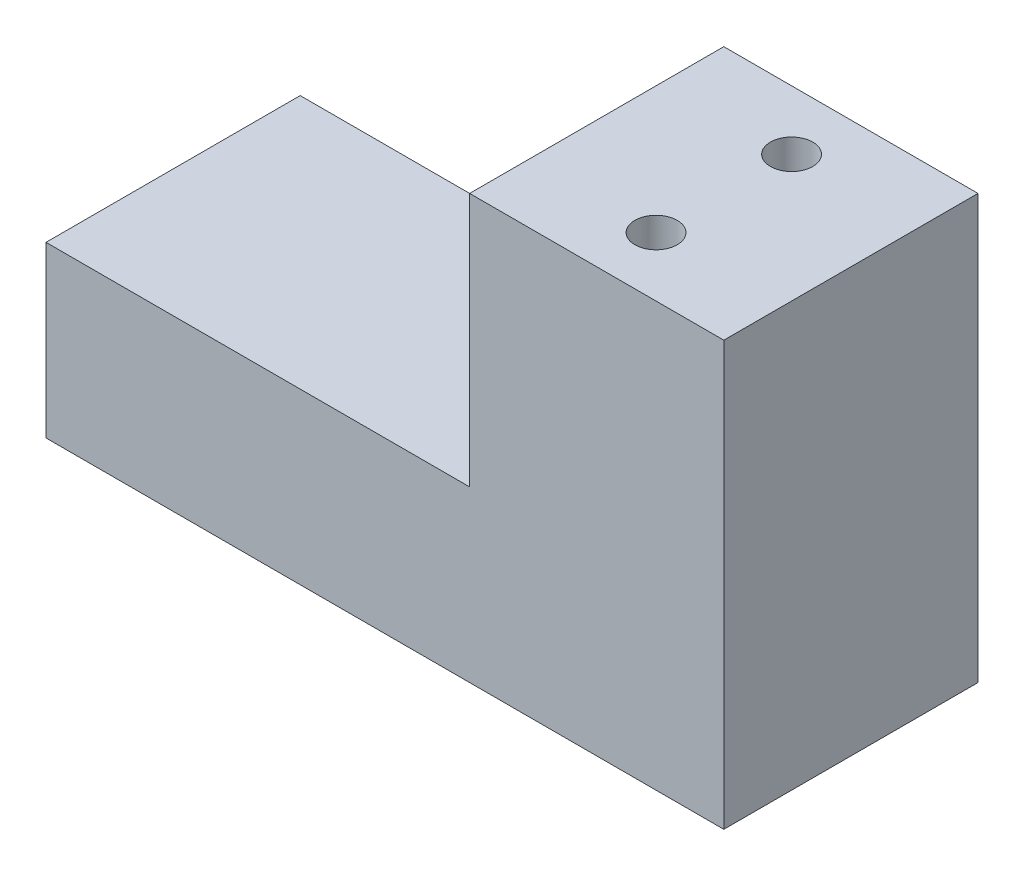
ISO-10303-21;
HEADER;
FILE_DESCRIPTION(('STEP AP214'),'2;1');
FILE_NAME('part.step','',(''),(''),'','','');
FILE_SCHEMA(('AUTOMOTIVE_DESIGN { 1 0 10303 214 1 1 1 1 }'));
ENDSEC;
DATA;
#1=APPLICATION_CONTEXT('core data for automotive mechanical design processes');
#2=APPLICATION_PROTOCOL_DEFINITION('international standard','automotive_design',2000,#1);
#3=PRODUCT_CONTEXT('',#1,'mechanical');
#4=PRODUCT('Part','Part','',(#3));
#5=PRODUCT_RELATED_PRODUCT_CATEGORY('part','',(#4));
#6=PRODUCT_DEFINITION_FORMATION('','',#4);
#7=PRODUCT_DEFINITION_CONTEXT('part definition',#1,'design');
#8=PRODUCT_DEFINITION('design','',#6,#7);
#9=PRODUCT_DEFINITION_SHAPE('','',#8);
#10=(LENGTH_UNIT() NAMED_UNIT(*) SI_UNIT(.MILLI.,.METRE.));
#11=(NAMED_UNIT(*) PLANE_ANGLE_UNIT() SI_UNIT($,.RADIAN.));
#12=(NAMED_UNIT(*) SI_UNIT($,.STERADIAN.) SOLID_ANGLE_UNIT());
#13=UNCERTAINTY_MEASURE_WITH_UNIT(LENGTH_MEASURE(1.E-05),#10,'distance_accuracy_value','');
#14=(GEOMETRIC_REPRESENTATION_CONTEXT(3) GLOBAL_UNCERTAINTY_ASSIGNED_CONTEXT((#13)) GLOBAL_UNIT_ASSIGNED_CONTEXT((#10,
#11,#12)) REPRESENTATION_CONTEXT('',''));
#15=CARTESIAN_POINT('',(0.,0.,0.));
#16=DIRECTION('',(0.,0.,1.));
#17=DIRECTION('',(1.,0.,0.));
#18=AXIS2_PLACEMENT_3D('',#15,#16,#17);
#19=CARTESIAN_POINT('',(0.,20.,30.));
#20=DIRECTION('',(0.,-1.,0.));
#21=DIRECTION('',(0.,0.,-1.));
#22=AXIS2_PLACEMENT_3D('',#19,#20,#21);
#23=PLANE('',#22);
#24=DIRECTION('',(0.,0.,1.));
#25=VECTOR('',#24,1.);
#26=CARTESIAN_POINT('',(50.,20.,30.));
#27=LINE('',#26,#25);
#28=CARTESIAN_POINT('',(50.,20.,0.));
#29=VERTEX_POINT('',#28);
#30=CARTESIAN_POINT('',(50.,20.,30.));
#31=VERTEX_POINT('',#30);
#32=EDGE_CURVE('E57',#29,#31,#27,.T.);
#33=ORIENTED_EDGE('',*,*,#32,.F.);
#34=DIRECTION('',(-1.,0.,0.));
#35=VECTOR('',#34,1.);
#36=CARTESIAN_POINT('',(0.,20.,0.));
#37=LINE('',#36,#35);
#38=CARTESIAN_POINT('',(0.,20.,0.));
#39=VERTEX_POINT('',#38);
#40=EDGE_CURVE('E79',#29,#39,#37,.T.);
#41=ORIENTED_EDGE('',*,*,#40,.T.);
#42=DIRECTION('',(0.,0.,-1.));
#43=VECTOR('',#42,1.);
#44=CARTESIAN_POINT('',(0.,20.,30.));
#45=LINE('',#44,#43);
#46=CARTESIAN_POINT('',(0.,20.,30.));
#47=VERTEX_POINT('',#46);
#48=EDGE_CURVE('E144',#47,#39,#45,.T.);
#49=ORIENTED_EDGE('',*,*,#48,.F.);
#50=DIRECTION('',(-1.,0.,0.));
#51=VECTOR('',#50,1.);
#52=CARTESIAN_POINT('',(0.,20.,30.));
#53=LINE('',#52,#51);
#54=EDGE_CURVE('E65',#31,#47,#53,.T.);
#55=ORIENTED_EDGE('',*,*,#54,.F.);
#56=EDGE_LOOP('',(#33,#41,#49,#55));
#57=FACE_BOUND('',#56,.T.);
#58=ADVANCED_FACE('F42',(#57),#23,.F.);
#59=CARTESIAN_POINT('',(0.,0.,30.));
#60=DIRECTION('',(1.,0.,0.));
#61=DIRECTION('',(0.,0.,-1.));
#62=AXIS2_PLACEMENT_3D('',#59,#60,#61);
#63=PLANE('',#62);
#64=DIRECTION('',(0.,-1.,0.));
#65=VECTOR('',#64,1.);
#66=CARTESIAN_POINT('',(0.,0.,0.));
#67=LINE('',#66,#65);
#68=CARTESIAN_POINT('',(0.,0.,0.));
#69=VERTEX_POINT('',#68);
#70=EDGE_CURVE('E137',#39,#69,#67,.T.);
#71=ORIENTED_EDGE('',*,*,#70,.T.);
#72=DIRECTION('',(0.,0.,-1.));
#73=VECTOR('',#72,1.);
#74=CARTESIAN_POINT('',(0.,0.,30.));
#75=LINE('',#74,#73);
#76=CARTESIAN_POINT('',(0.,0.,30.));
#77=VERTEX_POINT('',#76);
#78=EDGE_CURVE('E11',#77,#69,#75,.T.);
#79=ORIENTED_EDGE('',*,*,#78,.F.);
#80=DIRECTION('',(0.,-1.,0.));
#81=VECTOR('',#80,1.);
#82=CARTESIAN_POINT('',(0.,0.,30.));
#83=LINE('',#82,#81);
#84=EDGE_CURVE('E138',#47,#77,#83,.T.);
#85=ORIENTED_EDGE('',*,*,#84,.F.);
#86=ORIENTED_EDGE('',*,*,#48,.T.);
#87=EDGE_LOOP('',(#71,#79,#85,#86));
#88=FACE_BOUND('',#87,.T.);
#89=ADVANCED_FACE('F44',(#88),#63,.F.);
#90=CARTESIAN_POINT('',(0.,0.,30.));
#91=DIRECTION('',(0.,1.,0.));
#92=DIRECTION('',(0.,0.,1.));
#93=AXIS2_PLACEMENT_3D('',#90,#91,#92);
#94=PLANE('',#93);
#95=DIRECTION('',(1.,0.,0.));
#96=VECTOR('',#95,1.);
#97=CARTESIAN_POINT('',(0.,0.,0.));
#98=LINE('',#97,#96);
#99=CARTESIAN_POINT('',(80.,0.,0.));
#100=VERTEX_POINT('',#99);
#101=EDGE_CURVE('E109',#69,#100,#98,.T.);
#102=ORIENTED_EDGE('',*,*,#101,.T.);
#103=DIRECTION('',(0.,0.,-1.));
#104=VECTOR('',#103,1.);
#105=CARTESIAN_POINT('',(80.,0.,30.));
#106=LINE('',#105,#104);
#107=CARTESIAN_POINT('',(80.,0.,30.));
#108=VERTEX_POINT('',#107);
#109=EDGE_CURVE('E50',#108,#100,#106,.T.);
#110=ORIENTED_EDGE('',*,*,#109,.F.);
#111=DIRECTION('',(1.,0.,0.));
#112=VECTOR('',#111,1.);
#113=CARTESIAN_POINT('',(0.,0.,30.));
#114=LINE('',#113,#112);
#115=EDGE_CURVE('E84',#77,#108,#114,.T.);
#116=ORIENTED_EDGE('',*,*,#115,.F.);
#117=ORIENTED_EDGE('',*,*,#78,.T.);
#118=EDGE_LOOP('',(#102,#110,#116,#117));
#119=FACE_BOUND('',#118,.T.);
#120=ADVANCED_FACE('F152',(#119),#94,.F.);
#121=CARTESIAN_POINT('',(80.,0.,30.));
#122=DIRECTION('',(-1.,0.,0.));
#123=DIRECTION('',(0.,0.,1.));
#124=AXIS2_PLACEMENT_3D('',#121,#122,#123);
#125=PLANE('',#124);
#126=DIRECTION('',(0.,1.,0.));
#127=VECTOR('',#126,1.);
#128=CARTESIAN_POINT('',(80.,0.,0.));
#129=LINE('',#128,#127);
#130=CARTESIAN_POINT('',(80.,50.,0.));
#131=VERTEX_POINT('',#130);
#132=EDGE_CURVE('E102',#100,#131,#129,.T.);
#133=ORIENTED_EDGE('',*,*,#132,.T.);
#134=DIRECTION('',(0.,0.,-1.));
#135=VECTOR('',#134,1.);
#136=CARTESIAN_POINT('',(80.,50.,30.));
#137=LINE('',#136,#135);
#138=CARTESIAN_POINT('',(80.,50.,30.));
#139=VERTEX_POINT('',#138);
#140=EDGE_CURVE('E107',#139,#131,#137,.T.);
#141=ORIENTED_EDGE('',*,*,#140,.F.);
#142=DIRECTION('',(0.,1.,0.));
#143=VECTOR('',#142,1.);
#144=CARTESIAN_POINT('',(80.,0.,30.));
#145=LINE('',#144,#143);
#146=EDGE_CURVE('E141',#108,#139,#145,.T.);
#147=ORIENTED_EDGE('',*,*,#146,.F.);
#148=ORIENTED_EDGE('',*,*,#109,.T.);
#149=EDGE_LOOP('',(#133,#141,#147,#148));
#150=FACE_BOUND('',#149,.T.);
#151=ADVANCED_FACE('F104',(#150),#125,.F.);
#152=CARTESIAN_POINT('',(0.,0.,30.));
#153=DIRECTION('',(0.,0.,-1.));
#154=DIRECTION('',(-1.,0.,0.));
#155=AXIS2_PLACEMENT_3D('',#152,#153,#154);
#156=PLANE('',#155);
#157=ORIENTED_EDGE('',*,*,#84,.T.);
#158=ORIENTED_EDGE('',*,*,#115,.T.);
#159=ORIENTED_EDGE('',*,*,#146,.T.);
#160=DIRECTION('',(1.,0.,0.));
#161=VECTOR('',#160,1.);
#162=CARTESIAN_POINT('',(80.,50.,30.));
#163=LINE('',#162,#161);
#164=CARTESIAN_POINT('',(50.,50.,30.));
#165=VERTEX_POINT('',#164);
#166=EDGE_CURVE('E124',#165,#139,#163,.T.);
#167=ORIENTED_EDGE('',*,*,#166,.F.);
#168=DIRECTION('',(0.,-1.,0.));
#169=VECTOR('',#168,1.);
#170=CARTESIAN_POINT('',(50.,50.,30.));
#171=LINE('',#170,#169);
#172=EDGE_CURVE('E133',#165,#31,#171,.T.);
#173=ORIENTED_EDGE('',*,*,#172,.T.);
#174=ORIENTED_EDGE('',*,*,#54,.T.);
#175=EDGE_LOOP('',(#157,#158,#159,#167,#173,#174));
#176=FACE_BOUND('',#175,.T.);
#177=ADVANCED_FACE('F158',(#176),#156,.F.);
#178=CARTESIAN_POINT('',(0.,0.,0.));
#179=DIRECTION('',(0.,0.,-1.));
#180=DIRECTION('',(-1.,0.,0.));
#181=AXIS2_PLACEMENT_3D('',#178,#179,#180);
#182=PLANE('',#181);
#183=ORIENTED_EDGE('',*,*,#70,.F.);
#184=ORIENTED_EDGE('',*,*,#40,.F.);
#185=DIRECTION('',(0.,-1.,0.));
#186=VECTOR('',#185,1.);
#187=CARTESIAN_POINT('',(50.,50.,0.));
#188=LINE('',#187,#186);
#189=CARTESIAN_POINT('',(50.,50.,0.));
#190=VERTEX_POINT('',#189);
#191=EDGE_CURVE('E116',#190,#29,#188,.T.);
#192=ORIENTED_EDGE('',*,*,#191,.F.);
#193=DIRECTION('',(-1.,0.,0.));
#194=VECTOR('',#193,1.);
#195=CARTESIAN_POINT('',(80.,50.,0.));
#196=LINE('',#195,#194);
#197=EDGE_CURVE('E112',#131,#190,#196,.T.);
#198=ORIENTED_EDGE('',*,*,#197,.F.);
#199=ORIENTED_EDGE('',*,*,#132,.F.);
#200=ORIENTED_EDGE('',*,*,#101,.F.);
#201=EDGE_LOOP('',(#183,#184,#192,#198,#199,#200));
#202=FACE_BOUND('',#201,.T.);
#203=ADVANCED_FACE('F114',(#202),#182,.T.);
#204=CARTESIAN_POINT('',(50.,50.,30.));
#205=DIRECTION('',(1.,0.,0.));
#206=DIRECTION('',(0.,0.,-1.));
#207=AXIS2_PLACEMENT_3D('',#204,#205,#206);
#208=PLANE('',#207);
#209=ORIENTED_EDGE('',*,*,#32,.T.);
#210=ORIENTED_EDGE('',*,*,#172,.F.);
#211=DIRECTION('',(0.,0.,1.));
#212=VECTOR('',#211,1.);
#213=CARTESIAN_POINT('',(50.,50.,30.));
#214=LINE('',#213,#212);
#215=EDGE_CURVE('E119',#190,#165,#214,.T.);
#216=ORIENTED_EDGE('',*,*,#215,.F.);
#217=ORIENTED_EDGE('',*,*,#191,.T.);
#218=EDGE_LOOP('',(#209,#210,#216,#217));
#219=FACE_BOUND('',#218,.T.);
#220=ADVANCED_FACE('F167',(#219),#208,.F.);
#221=CARTESIAN_POINT('',(0.,50.,0.));
#222=DIRECTION('',(0.,1.,0.));
#223=DIRECTION('',(0.,0.,1.));
#224=AXIS2_PLACEMENT_3D('',#221,#222,#223);
#225=PLANE('',#224);
#226=CARTESIAN_POINT('',(65.,50.,7.));
#227=DIRECTION('',(0.,1.,0.));
#228=DIRECTION('',(0.,0.,1.));
#229=AXIS2_PLACEMENT_3D('',#226,#227,#228);
#230=CIRCLE('',#229,2.5);
#231=CARTESIAN_POINT('',(65.,50.,9.49999999999999));
#232=VERTEX_POINT('',#231);
#233=EDGE_CURVE('E195',#232,#232,#230,.T.);
#234=ORIENTED_EDGE('',*,*,#233,.F.);
#235=EDGE_LOOP('',(#234));
#236=FACE_BOUND('',#235,.T.);
#237=CARTESIAN_POINT('',(65.,50.,23.));
#238=DIRECTION('',(0.,1.,0.));
#239=DIRECTION('',(0.,0.,1.));
#240=AXIS2_PLACEMENT_3D('',#237,#238,#239);
#241=CIRCLE('',#240,2.5);
#242=CARTESIAN_POINT('',(65.,50.,25.5));
#243=VERTEX_POINT('',#242);
#244=EDGE_CURVE('E198',#243,#243,#241,.T.);
#245=ORIENTED_EDGE('',*,*,#244,.F.);
#246=EDGE_LOOP('',(#245));
#247=FACE_BOUND('',#246,.T.);
#248=ORIENTED_EDGE('',*,*,#140,.T.);
#249=ORIENTED_EDGE('',*,*,#197,.T.);
#250=ORIENTED_EDGE('',*,*,#215,.T.);
#251=ORIENTED_EDGE('',*,*,#166,.T.);
#252=EDGE_LOOP('',(#248,#249,#250,#251));
#253=FACE_BOUND('',#252,.T.);
#254=ADVANCED_FACE('F122',(#236,#247,#253),#225,.T.);
#255=CARTESIAN_POINT('',(65.,40.,23.));
#256=DIRECTION('',(0.,1.,0.));
#257=DIRECTION('',(0.,0.,1.));
#258=AXIS2_PLACEMENT_3D('',#255,#256,#257);
#259=CYLINDRICAL_SURFACE('',#258,2.5);
#260=CARTESIAN_POINT('',(65.,40.,23.));
#261=DIRECTION('',(0.,1.,0.));
#262=DIRECTION('',(0.,0.,1.));
#263=AXIS2_PLACEMENT_3D('',#260,#261,#262);
#264=CIRCLE('',#263,2.5);
#265=CARTESIAN_POINT('',(65.,40.,25.5));
#266=VERTEX_POINT('',#265);
#267=EDGE_CURVE('E129',#266,#266,#264,.T.);
#268=ORIENTED_EDGE('',*,*,#267,.F.);
#269=EDGE_LOOP('',(#268));
#270=FACE_BOUND('',#269,.T.);
#271=ORIENTED_EDGE('',*,*,#244,.T.);
#272=EDGE_LOOP('',(#271));
#273=FACE_BOUND('',#272,.T.);
#274=ADVANCED_FACE('F175',(#270,#273),#259,.F.);
#275=CARTESIAN_POINT('',(65.,40.,23.));
#276=DIRECTION('',(0.,1.,0.));
#277=DIRECTION('',(0.,0.,1.));
#278=AXIS2_PLACEMENT_3D('',#275,#276,#277);
#279=PLANE('',#278);
#280=ORIENTED_EDGE('',*,*,#267,.T.);
#281=EDGE_LOOP('',(#280));
#282=FACE_BOUND('',#281,.T.);
#283=ADVANCED_FACE('F177',(#282),#279,.T.);
#284=CARTESIAN_POINT('',(65.,40.,7.));
#285=DIRECTION('',(0.,1.,0.));
#286=DIRECTION('',(0.,0.,1.));
#287=AXIS2_PLACEMENT_3D('',#284,#285,#286);
#288=CYLINDRICAL_SURFACE('',#287,2.5);
#289=CARTESIAN_POINT('',(65.,40.,7.));
#290=DIRECTION('',(0.,1.,0.));
#291=DIRECTION('',(0.,0.,1.));
#292=AXIS2_PLACEMENT_3D('',#289,#290,#291);
#293=CIRCLE('',#292,2.5);
#294=CARTESIAN_POINT('',(65.,40.,9.49999999999999));
#295=VERTEX_POINT('',#294);
#296=EDGE_CURVE('E126',#295,#295,#293,.T.);
#297=ORIENTED_EDGE('',*,*,#296,.F.);
#298=EDGE_LOOP('',(#297));
#299=FACE_BOUND('',#298,.T.);
#300=ORIENTED_EDGE('',*,*,#233,.T.);
#301=EDGE_LOOP('',(#300));
#302=FACE_BOUND('',#301,.T.);
#303=ADVANCED_FACE('F180',(#299,#302),#288,.F.);
#304=CARTESIAN_POINT('',(65.,40.,7.));
#305=DIRECTION('',(0.,1.,0.));
#306=DIRECTION('',(0.,0.,1.));
#307=AXIS2_PLACEMENT_3D('',#304,#305,#306);
#308=PLANE('',#307);
#309=ORIENTED_EDGE('',*,*,#296,.T.);
#310=EDGE_LOOP('',(#309));
#311=FACE_BOUND('',#310,.T.);
#312=ADVANCED_FACE('F187',(#311),#308,.T.);
#313=CLOSED_SHELL('',(#58,#89,#120,#151,#177,#203,#220,#254,#274,#283,#303,#312));
#314=MANIFOLD_SOLID_BREP('B2',#313);
#315=ADVANCED_BREP_SHAPE_REPRESENTATION('',(#18,#314),#14);
#316=SHAPE_DEFINITION_REPRESENTATION(#9,#315);
ENDSEC;
END-ISO-10303-21;
